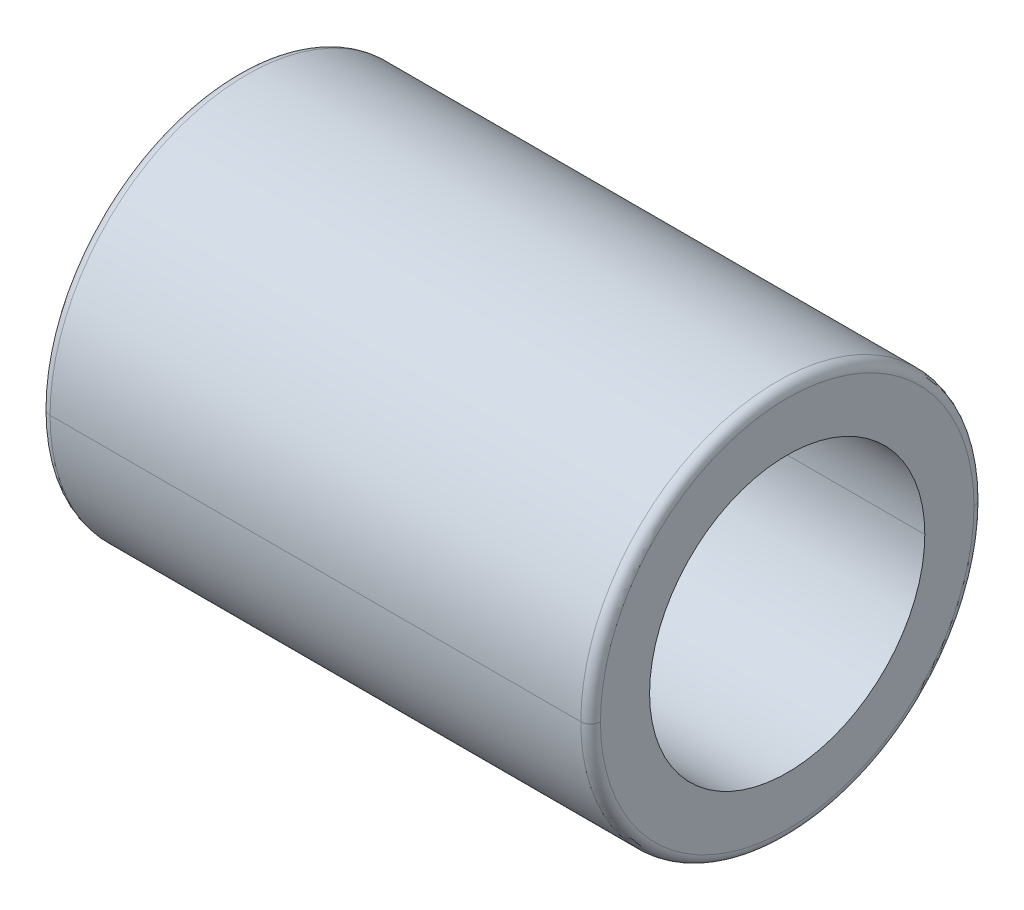
ISO-10303-21;
HEADER;
FILE_DESCRIPTION(('STEP AP214'),'2;1');
FILE_NAME('part.step','',(''),(''),'','','');
FILE_SCHEMA(('AUTOMOTIVE_DESIGN { 1 0 10303 214 1 1 1 1 }'));
ENDSEC;
DATA;
#1=APPLICATION_CONTEXT('core data for automotive mechanical design processes');
#2=APPLICATION_PROTOCOL_DEFINITION('international standard','automotive_design',2000,#1);
#3=PRODUCT_CONTEXT('',#1,'mechanical');
#4=PRODUCT('Part','Part','',(#3));
#5=PRODUCT_RELATED_PRODUCT_CATEGORY('part','',(#4));
#6=PRODUCT_DEFINITION_FORMATION('','',#4);
#7=PRODUCT_DEFINITION_CONTEXT('part definition',#1,'design');
#8=PRODUCT_DEFINITION('design','',#6,#7);
#9=PRODUCT_DEFINITION_SHAPE('','',#8);
#10=(LENGTH_UNIT() NAMED_UNIT(*) SI_UNIT(.MILLI.,.METRE.));
#11=(NAMED_UNIT(*) PLANE_ANGLE_UNIT() SI_UNIT($,.RADIAN.));
#12=(NAMED_UNIT(*) SI_UNIT($,.STERADIAN.) SOLID_ANGLE_UNIT());
#13=UNCERTAINTY_MEASURE_WITH_UNIT(LENGTH_MEASURE(1.E-05),#10,'distance_accuracy_value','');
#14=(GEOMETRIC_REPRESENTATION_CONTEXT(3) GLOBAL_UNCERTAINTY_ASSIGNED_CONTEXT((#13)) GLOBAL_UNIT_ASSIGNED_CONTEXT((#10,
#11,#12)) REPRESENTATION_CONTEXT('',''));
#15=CARTESIAN_POINT('',(0.,0.,0.));
#16=DIRECTION('',(0.,0.,1.));
#17=DIRECTION('',(1.,0.,0.));
#18=AXIS2_PLACEMENT_3D('',#15,#16,#17);
#19=CARTESIAN_POINT('',(0.,0.,0.));
#20=DIRECTION('',(-1.,0.,0.));
#21=DIRECTION('',(0.,0.,1.));
#22=AXIS2_PLACEMENT_3D('',#19,#20,#21);
#23=CYLINDRICAL_SURFACE('',#22,7.);
#24=DIRECTION('',(-1.,0.,0.));
#25=VECTOR('',#24,1.);
#26=CARTESIAN_POINT('',(0.,0.,-7.));
#27=LINE('',#26,#25);
#28=CARTESIAN_POINT('',(27.5,0.,-7.));
#29=VERTEX_POINT('',#28);
#30=CARTESIAN_POINT('',(-0.5,0.,-7.));
#31=VERTEX_POINT('',#30);
#32=EDGE_CURVE('E149',#29,#31,#27,.T.);
#33=ORIENTED_EDGE('',*,*,#32,.F.);
#34=CARTESIAN_POINT('',(27.5,0.,0.));
#35=DIRECTION('',(-1.,0.,0.));
#36=DIRECTION('',(0.,0.,1.));
#37=AXIS2_PLACEMENT_3D('',#34,#35,#36);
#38=CIRCLE('',#37,7.);
#39=CARTESIAN_POINT('',(27.5,0.,7.));
#40=VERTEX_POINT('',#39);
#41=EDGE_CURVE('E11',#40,#29,#38,.T.);
#42=ORIENTED_EDGE('',*,*,#41,.F.);
#43=DIRECTION('',(-1.,0.,0.));
#44=VECTOR('',#43,1.);
#45=CARTESIAN_POINT('',(0.,0.,7.));
#46=LINE('',#45,#44);
#47=CARTESIAN_POINT('',(-0.5,0.,7.));
#48=VERTEX_POINT('',#47);
#49=EDGE_CURVE('E143',#40,#48,#46,.T.);
#50=ORIENTED_EDGE('',*,*,#49,.T.);
#51=CARTESIAN_POINT('',(-0.5,0.,0.));
#52=DIRECTION('',(-1.,0.,0.));
#53=DIRECTION('',(0.,0.,1.));
#54=AXIS2_PLACEMENT_3D('',#51,#52,#53);
#55=CIRCLE('',#54,7.);
#56=EDGE_CURVE('E64',#48,#31,#55,.T.);
#57=ORIENTED_EDGE('',*,*,#56,.T.);
#58=EDGE_LOOP('',(#33,#42,#50,#57));
#59=FACE_BOUND('',#58,.T.);
#60=ADVANCED_FACE('F16',(#59),#23,.F.);
#61=CARTESIAN_POINT('',(27.5,9.5,0.));
#62=DIRECTION('',(-1.,0.,0.));
#63=DIRECTION('',(0.,0.,1.));
#64=AXIS2_PLACEMENT_3D('',#61,#62,#63);
#65=PLANE('',#64);
#66=ORIENTED_EDGE('',*,*,#41,.T.);
#67=CARTESIAN_POINT('',(27.5,0.,0.));
#68=DIRECTION('',(-1.,0.,0.));
#69=DIRECTION('',(0.,0.,1.));
#70=AXIS2_PLACEMENT_3D('',#67,#68,#69);
#71=CIRCLE('',#70,7.);
#72=EDGE_CURVE('E20',#29,#40,#71,.T.);
#73=ORIENTED_EDGE('',*,*,#72,.T.);
#74=EDGE_LOOP('',(#66,#73));
#75=FACE_BOUND('',#74,.T.);
#76=CARTESIAN_POINT('',(27.5,0.,0.));
#77=DIRECTION('',(-1.,0.,0.));
#78=DIRECTION('',(0.,0.,1.));
#79=AXIS2_PLACEMENT_3D('',#76,#77,#78);
#80=CIRCLE('',#79,9.5);
#81=CARTESIAN_POINT('',(27.5,0.,9.5));
#82=VERTEX_POINT('',#81);
#83=CARTESIAN_POINT('',(27.5,0.,-9.5));
#84=VERTEX_POINT('',#83);
#85=EDGE_CURVE('E136',#82,#84,#80,.T.);
#86=ORIENTED_EDGE('',*,*,#85,.F.);
#87=CARTESIAN_POINT('',(27.5,0.,0.));
#88=DIRECTION('',(-1.,0.,0.));
#89=DIRECTION('',(0.,0.,1.));
#90=AXIS2_PLACEMENT_3D('',#87,#88,#89);
#91=CIRCLE('',#90,9.5);
#92=EDGE_CURVE('E27',#84,#82,#91,.T.);
#93=ORIENTED_EDGE('',*,*,#92,.F.);
#94=EDGE_LOOP('',(#86,#93));
#95=FACE_BOUND('',#94,.T.);
#96=ADVANCED_FACE('F257',(#75,#95),#65,.F.);
#97=CARTESIAN_POINT('',(27.,0.,0.));
#98=DIRECTION('',(-1.,0.,0.));
#99=DIRECTION('',(0.,0.,1.));
#100=AXIS2_PLACEMENT_3D('',#97,#98,#99);
#101=TOROIDAL_SURFACE('',#100,9.5,0.5);
#102=CARTESIAN_POINT('',(27.,0.,-9.5));
#103=DIRECTION('',(0.,1.,0.));
#104=DIRECTION('',(0.,0.,1.));
#105=AXIS2_PLACEMENT_3D('',#102,#103,#104);
#106=CIRCLE('',#105,0.5);
#107=CARTESIAN_POINT('',(27.,0.,-10.));
#108=VERTEX_POINT('',#107);
#109=EDGE_CURVE('E113',#84,#108,#106,.T.);
#110=ORIENTED_EDGE('',*,*,#109,.F.);
#111=ORIENTED_EDGE('',*,*,#92,.T.);
#112=CARTESIAN_POINT('',(27.,0.,9.5));
#113=DIRECTION('',(0.,-1.,0.));
#114=DIRECTION('',(0.,0.,-1.));
#115=AXIS2_PLACEMENT_3D('',#112,#113,#114);
#116=CIRCLE('',#115,0.5);
#117=CARTESIAN_POINT('',(27.,0.,10.));
#118=VERTEX_POINT('',#117);
#119=EDGE_CURVE('E116',#82,#118,#116,.T.);
#120=ORIENTED_EDGE('',*,*,#119,.T.);
#121=CARTESIAN_POINT('',(27.,0.,0.));
#122=DIRECTION('',(-1.,0.,0.));
#123=DIRECTION('',(0.,0.,1.));
#124=AXIS2_PLACEMENT_3D('',#121,#122,#123);
#125=CIRCLE('',#124,10.);
#126=EDGE_CURVE('E110',#108,#118,#125,.T.);
#127=ORIENTED_EDGE('',*,*,#126,.F.);
#128=EDGE_LOOP('',(#110,#111,#120,#127));
#129=FACE_BOUND('',#128,.T.);
#130=ADVANCED_FACE('F111',(#129),#101,.T.);
#131=CARTESIAN_POINT('',(0.,0.,0.));
#132=DIRECTION('',(-1.,0.,0.));
#133=DIRECTION('',(0.,0.,1.));
#134=AXIS2_PLACEMENT_3D('',#131,#132,#133);
#135=CYLINDRICAL_SURFACE('',#134,10.);
#136=DIRECTION('',(-1.,0.,0.));
#137=VECTOR('',#136,1.);
#138=CARTESIAN_POINT('',(0.,0.,-10.));
#139=LINE('',#138,#137);
#140=CARTESIAN_POINT('',(0.,0.,-10.));
#141=VERTEX_POINT('',#140);
#142=EDGE_CURVE('E122',#108,#141,#139,.T.);
#143=ORIENTED_EDGE('',*,*,#142,.F.);
#144=ORIENTED_EDGE('',*,*,#126,.T.);
#145=DIRECTION('',(-1.,0.,0.));
#146=VECTOR('',#145,1.);
#147=CARTESIAN_POINT('',(0.,0.,10.));
#148=LINE('',#147,#146);
#149=CARTESIAN_POINT('',(0.,0.,10.));
#150=VERTEX_POINT('',#149);
#151=EDGE_CURVE('E131',#118,#150,#148,.T.);
#152=ORIENTED_EDGE('',*,*,#151,.T.);
#153=CARTESIAN_POINT('',(0.,0.,0.));
#154=DIRECTION('',(-1.,0.,0.));
#155=DIRECTION('',(0.,0.,1.));
#156=AXIS2_PLACEMENT_3D('',#153,#154,#155);
#157=CIRCLE('',#156,10.);
#158=EDGE_CURVE('E89',#141,#150,#157,.T.);
#159=ORIENTED_EDGE('',*,*,#158,.F.);
#160=EDGE_LOOP('',(#143,#144,#152,#159));
#161=FACE_BOUND('',#160,.T.);
#162=ADVANCED_FACE('F18',(#161),#135,.T.);
#163=CARTESIAN_POINT('',(0.,0.,0.));
#164=DIRECTION('',(-1.,0.,0.));
#165=DIRECTION('',(0.,0.,1.));
#166=AXIS2_PLACEMENT_3D('',#163,#164,#165);
#167=TOROIDAL_SURFACE('',#166,9.5,0.5);
#168=CARTESIAN_POINT('',(0.,0.,-9.5));
#169=DIRECTION('',(0.,1.,0.));
#170=DIRECTION('',(0.,0.,1.));
#171=AXIS2_PLACEMENT_3D('',#168,#169,#170);
#172=CIRCLE('',#171,0.5);
#173=CARTESIAN_POINT('',(-0.5,0.,-9.5));
#174=VERTEX_POINT('',#173);
#175=EDGE_CURVE('E152',#141,#174,#172,.T.);
#176=ORIENTED_EDGE('',*,*,#175,.F.);
#177=ORIENTED_EDGE('',*,*,#158,.T.);
#178=CARTESIAN_POINT('',(0.,0.,9.5));
#179=DIRECTION('',(0.,-1.,0.));
#180=DIRECTION('',(0.,0.,-1.));
#181=AXIS2_PLACEMENT_3D('',#178,#179,#180);
#182=CIRCLE('',#181,0.5);
#183=CARTESIAN_POINT('',(-0.5,0.,9.5));
#184=VERTEX_POINT('',#183);
#185=EDGE_CURVE('E156',#150,#184,#182,.T.);
#186=ORIENTED_EDGE('',*,*,#185,.T.);
#187=CARTESIAN_POINT('',(-0.5,0.,0.));
#188=DIRECTION('',(-1.,0.,0.));
#189=DIRECTION('',(0.,0.,1.));
#190=AXIS2_PLACEMENT_3D('',#187,#188,#189);
#191=CIRCLE('',#190,9.5);
#192=EDGE_CURVE('E41',#174,#184,#191,.T.);
#193=ORIENTED_EDGE('',*,*,#192,.F.);
#194=EDGE_LOOP('',(#176,#177,#186,#193));
#195=FACE_BOUND('',#194,.T.);
#196=ADVANCED_FACE('F245',(#195),#167,.T.);
#197=CARTESIAN_POINT('',(-0.5,9.5,0.));
#198=DIRECTION('',(1.,0.,0.));
#199=DIRECTION('',(0.,1.,0.));
#200=AXIS2_PLACEMENT_3D('',#197,#198,#199);
#201=PLANE('',#200);
#202=ORIENTED_EDGE('',*,*,#56,.F.);
#203=CARTESIAN_POINT('',(-0.5,0.,0.));
#204=DIRECTION('',(-1.,0.,0.));
#205=DIRECTION('',(0.,0.,1.));
#206=AXIS2_PLACEMENT_3D('',#203,#204,#205);
#207=CIRCLE('',#206,7.);
#208=EDGE_CURVE('E146',#31,#48,#207,.T.);
#209=ORIENTED_EDGE('',*,*,#208,.F.);
#210=EDGE_LOOP('',(#202,#209));
#211=FACE_BOUND('',#210,.T.);
#212=CARTESIAN_POINT('',(-0.5,0.,0.));
#213=DIRECTION('',(-1.,0.,0.));
#214=DIRECTION('',(0.,0.,1.));
#215=AXIS2_PLACEMENT_3D('',#212,#213,#214);
#216=CIRCLE('',#215,9.5);
#217=EDGE_CURVE('E155',#184,#174,#216,.T.);
#218=ORIENTED_EDGE('',*,*,#217,.T.);
#219=ORIENTED_EDGE('',*,*,#192,.T.);
#220=EDGE_LOOP('',(#218,#219));
#221=FACE_BOUND('',#220,.T.);
#222=ADVANCED_FACE('F249',(#211,#221),#201,.F.);
#223=CARTESIAN_POINT('',(0.,0.,0.));
#224=DIRECTION('',(-1.,0.,0.));
#225=DIRECTION('',(0.,0.,1.));
#226=AXIS2_PLACEMENT_3D('',#223,#224,#225);
#227=TOROIDAL_SURFACE('',#226,9.5,0.5);
#228=CARTESIAN_POINT('',(0.,0.,0.));
#229=DIRECTION('',(-1.,0.,0.));
#230=DIRECTION('',(0.,0.,1.));
#231=AXIS2_PLACEMENT_3D('',#228,#229,#230);
#232=CIRCLE('',#231,10.);
#233=EDGE_CURVE('E127',#150,#141,#232,.T.);
#234=ORIENTED_EDGE('',*,*,#233,.T.);
#235=ORIENTED_EDGE('',*,*,#175,.T.);
#236=ORIENTED_EDGE('',*,*,#217,.F.);
#237=ORIENTED_EDGE('',*,*,#185,.F.);
#238=EDGE_LOOP('',(#234,#235,#236,#237));
#239=FACE_BOUND('',#238,.T.);
#240=ADVANCED_FACE('F265',(#239),#227,.T.);
#241=CARTESIAN_POINT('',(0.,0.,0.));
#242=DIRECTION('',(-1.,0.,0.));
#243=DIRECTION('',(0.,0.,1.));
#244=AXIS2_PLACEMENT_3D('',#241,#242,#243);
#245=CYLINDRICAL_SURFACE('',#244,10.);
#246=CARTESIAN_POINT('',(27.,0.,0.));
#247=DIRECTION('',(-1.,0.,0.));
#248=DIRECTION('',(0.,0.,1.));
#249=AXIS2_PLACEMENT_3D('',#246,#247,#248);
#250=CIRCLE('',#249,10.);
#251=EDGE_CURVE('E129',#118,#108,#250,.T.);
#252=ORIENTED_EDGE('',*,*,#251,.T.);
#253=ORIENTED_EDGE('',*,*,#142,.T.);
#254=ORIENTED_EDGE('',*,*,#233,.F.);
#255=ORIENTED_EDGE('',*,*,#151,.F.);
#256=EDGE_LOOP('',(#252,#253,#254,#255));
#257=FACE_BOUND('',#256,.T.);
#258=ADVANCED_FACE('F130',(#257),#245,.T.);
#259=CARTESIAN_POINT('',(27.,0.,0.));
#260=DIRECTION('',(-1.,0.,0.));
#261=DIRECTION('',(0.,0.,1.));
#262=AXIS2_PLACEMENT_3D('',#259,#260,#261);
#263=TOROIDAL_SURFACE('',#262,9.5,0.5);
#264=ORIENTED_EDGE('',*,*,#85,.T.);
#265=ORIENTED_EDGE('',*,*,#109,.T.);
#266=ORIENTED_EDGE('',*,*,#251,.F.);
#267=ORIENTED_EDGE('',*,*,#119,.F.);
#268=EDGE_LOOP('',(#264,#265,#266,#267));
#269=FACE_BOUND('',#268,.T.);
#270=ADVANCED_FACE('F135',(#269),#263,.T.);
#271=CARTESIAN_POINT('',(0.,0.,0.));
#272=DIRECTION('',(-1.,0.,0.));
#273=DIRECTION('',(0.,0.,1.));
#274=AXIS2_PLACEMENT_3D('',#271,#272,#273);
#275=CYLINDRICAL_SURFACE('',#274,7.);
#276=ORIENTED_EDGE('',*,*,#72,.F.);
#277=ORIENTED_EDGE('',*,*,#32,.T.);
#278=ORIENTED_EDGE('',*,*,#208,.T.);
#279=ORIENTED_EDGE('',*,*,#49,.F.);
#280=EDGE_LOOP('',(#276,#277,#278,#279));
#281=FACE_BOUND('',#280,.T.);
#282=ADVANCED_FACE('F285',(#281),#275,.F.);
#283=CLOSED_SHELL('',(#60,#96,#130,#162,#196,#222,#240,#258,#270,#282));
#284=MANIFOLD_SOLID_BREP('B1',#283);
#285=ADVANCED_BREP_SHAPE_REPRESENTATION('',(#18,#284),#14);
#286=SHAPE_DEFINITION_REPRESENTATION(#9,#285);
ENDSEC;
END-ISO-10303-21;
